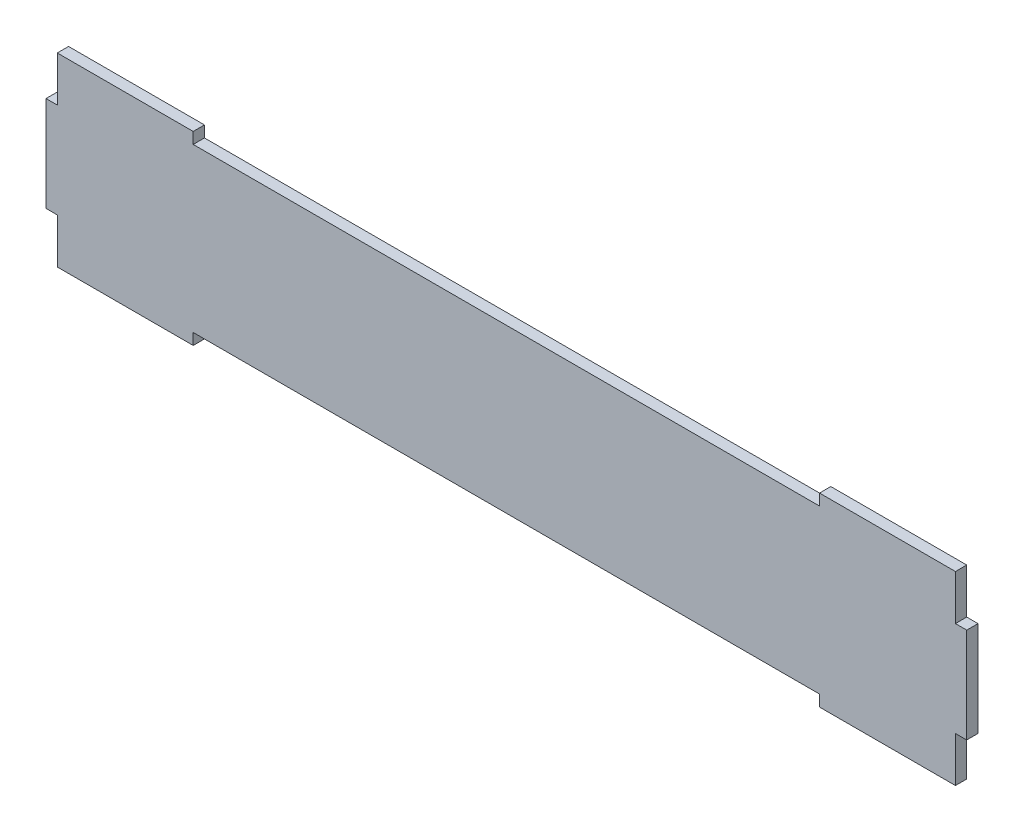
ISO-10303-21;
HEADER;
FILE_DESCRIPTION(('STEP AP214'),'2;1');
FILE_NAME('part.step','',(''),(''),'','','');
FILE_SCHEMA(('AUTOMOTIVE_DESIGN { 1 0 10303 214 1 1 1 1 }'));
ENDSEC;
DATA;
#1=APPLICATION_CONTEXT('core data for automotive mechanical design processes');
#2=APPLICATION_PROTOCOL_DEFINITION('international standard','automotive_design',2000,#1);
#3=PRODUCT_CONTEXT('',#1,'mechanical');
#4=PRODUCT('Part','Part','',(#3));
#5=PRODUCT_RELATED_PRODUCT_CATEGORY('part','',(#4));
#6=PRODUCT_DEFINITION_FORMATION('','',#4);
#7=PRODUCT_DEFINITION_CONTEXT('part definition',#1,'design');
#8=PRODUCT_DEFINITION('design','',#6,#7);
#9=PRODUCT_DEFINITION_SHAPE('','',#8);
#10=(LENGTH_UNIT() NAMED_UNIT(*) SI_UNIT(.MILLI.,.METRE.));
#11=(NAMED_UNIT(*) PLANE_ANGLE_UNIT() SI_UNIT($,.RADIAN.));
#12=(NAMED_UNIT(*) SI_UNIT($,.STERADIAN.) SOLID_ANGLE_UNIT());
#13=UNCERTAINTY_MEASURE_WITH_UNIT(LENGTH_MEASURE(1.E-05),#10,'distance_accuracy_value','');
#14=(GEOMETRIC_REPRESENTATION_CONTEXT(3) GLOBAL_UNCERTAINTY_ASSIGNED_CONTEXT((#13)) GLOBAL_UNIT_ASSIGNED_CONTEXT((#10,
#11,#12)) REPRESENTATION_CONTEXT('',''));
#15=CARTESIAN_POINT('',(0.,0.,0.));
#16=DIRECTION('',(0.,0.,1.));
#17=DIRECTION('',(1.,0.,0.));
#18=AXIS2_PLACEMENT_3D('',#15,#16,#17);
#19=CARTESIAN_POINT('',(0.,0.,6.));
#20=DIRECTION('',(0.,1.,0.));
#21=DIRECTION('',(0.,0.,1.));
#22=AXIS2_PLACEMENT_3D('',#19,#20,#21);
#23=PLANE('',#22);
#24=DIRECTION('',(1.,0.,0.));
#25=VECTOR('',#24,1.);
#26=CARTESIAN_POINT('',(0.,0.,0.));
#27=LINE('',#26,#25);
#28=CARTESIAN_POINT('',(6.,0.,0.));
#29=VERTEX_POINT('',#28);
#30=CARTESIAN_POINT('',(78.3333333333333,0.,0.));
#31=VERTEX_POINT('',#30);
#32=EDGE_CURVE('E201',#29,#31,#27,.T.);
#33=ORIENTED_EDGE('',*,*,#32,.T.);
#34=DIRECTION('',(0.,0.,1.));
#35=VECTOR('',#34,1.);
#36=CARTESIAN_POINT('',(78.3333333333333,0.,0.));
#37=LINE('',#36,#35);
#38=CARTESIAN_POINT('',(78.3333333333333,0.,6.));
#39=VERTEX_POINT('',#38);
#40=EDGE_CURVE('E220',#31,#39,#37,.T.);
#41=ORIENTED_EDGE('',*,*,#40,.T.);
#42=DIRECTION('',(1.,0.,0.));
#43=VECTOR('',#42,1.);
#44=CARTESIAN_POINT('',(0.,0.,6.));
#45=LINE('',#44,#43);
#46=CARTESIAN_POINT('',(6.,0.,6.));
#47=VERTEX_POINT('',#46);
#48=EDGE_CURVE('E301',#47,#39,#45,.T.);
#49=ORIENTED_EDGE('',*,*,#48,.F.);
#50=DIRECTION('',(0.,0.,1.));
#51=VECTOR('',#50,1.);
#52=CARTESIAN_POINT('',(6.,0.,0.));
#53=LINE('',#52,#51);
#54=EDGE_CURVE('E222',#29,#47,#53,.T.);
#55=ORIENTED_EDGE('',*,*,#54,.F.);
#56=EDGE_LOOP('',(#33,#41,#49,#55));
#57=FACE_BOUND('',#56,.T.);
#58=ADVANCED_FACE('F32',(#57),#23,.F.);
#59=CARTESIAN_POINT('',(0.,98.65,6.));
#60=DIRECTION('',(0.,-1.,0.));
#61=DIRECTION('',(0.,0.,-1.));
#62=AXIS2_PLACEMENT_3D('',#59,#60,#61);
#63=PLANE('',#62);
#64=DIRECTION('',(-1.,0.,0.));
#65=VECTOR('',#64,1.);
#66=CARTESIAN_POINT('',(0.,98.65,6.));
#67=LINE('',#66,#65);
#68=CARTESIAN_POINT('',(78.3333333333334,98.65,6.));
#69=VERTEX_POINT('',#68);
#70=CARTESIAN_POINT('',(6.,98.65,6.));
#71=VERTEX_POINT('',#70);
#72=EDGE_CURVE('E41',#69,#71,#67,.T.);
#73=ORIENTED_EDGE('',*,*,#72,.F.);
#74=DIRECTION('',(0.,0.,1.));
#75=VECTOR('',#74,1.);
#76=CARTESIAN_POINT('',(78.3333333333334,98.65,0.));
#77=LINE('',#76,#75);
#78=CARTESIAN_POINT('',(78.3333333333334,98.65,0.));
#79=VERTEX_POINT('',#78);
#80=EDGE_CURVE('E320',#79,#69,#77,.T.);
#81=ORIENTED_EDGE('',*,*,#80,.F.);
#82=DIRECTION('',(-1.,0.,0.));
#83=VECTOR('',#82,1.);
#84=CARTESIAN_POINT('',(0.,98.65,0.));
#85=LINE('',#84,#83);
#86=CARTESIAN_POINT('',(6.,98.65,0.));
#87=VERTEX_POINT('',#86);
#88=EDGE_CURVE('E208',#79,#87,#85,.T.);
#89=ORIENTED_EDGE('',*,*,#88,.T.);
#90=DIRECTION('',(0.,0.,1.));
#91=VECTOR('',#90,1.);
#92=CARTESIAN_POINT('',(6.,98.65,0.));
#93=LINE('',#92,#91);
#94=EDGE_CURVE('E278',#87,#71,#93,.T.);
#95=ORIENTED_EDGE('',*,*,#94,.T.);
#96=EDGE_LOOP('',(#73,#81,#89,#95));
#97=FACE_BOUND('',#96,.T.);
#98=ADVANCED_FACE('F366',(#97),#63,.F.);
#99=CARTESIAN_POINT('',(0.,0.,6.));
#100=DIRECTION('',(1.,0.,0.));
#101=DIRECTION('',(0.,0.,-1.));
#102=AXIS2_PLACEMENT_3D('',#99,#100,#101);
#103=PLANE('',#102);
#104=DIRECTION('',(0.,-1.,0.));
#105=VECTOR('',#104,1.);
#106=CARTESIAN_POINT('',(0.,0.,6.));
#107=LINE('',#106,#105);
#108=CARTESIAN_POINT('',(0.,74.65,6.));
#109=VERTEX_POINT('',#108);
#110=CARTESIAN_POINT('',(0.,24.,6.));
#111=VERTEX_POINT('',#110);
#112=EDGE_CURVE('E190',#109,#111,#107,.T.);
#113=ORIENTED_EDGE('',*,*,#112,.F.);
#114=DIRECTION('',(0.,0.,1.));
#115=VECTOR('',#114,1.);
#116=CARTESIAN_POINT('',(0.,74.65,0.));
#117=LINE('',#116,#115);
#118=CARTESIAN_POINT('',(0.,74.65,0.));
#119=VERTEX_POINT('',#118);
#120=EDGE_CURVE('E175',#119,#109,#117,.T.);
#121=ORIENTED_EDGE('',*,*,#120,.F.);
#122=DIRECTION('',(0.,-1.,0.));
#123=VECTOR('',#122,1.);
#124=CARTESIAN_POINT('',(0.,0.,0.));
#125=LINE('',#124,#123);
#126=CARTESIAN_POINT('',(0.,24.,0.));
#127=VERTEX_POINT('',#126);
#128=EDGE_CURVE('E188',#119,#127,#125,.T.);
#129=ORIENTED_EDGE('',*,*,#128,.T.);
#130=DIRECTION('',(0.,0.,1.));
#131=VECTOR('',#130,1.);
#132=CARTESIAN_POINT('',(0.,24.,0.));
#133=LINE('',#132,#131);
#134=EDGE_CURVE('E263',#127,#111,#133,.T.);
#135=ORIENTED_EDGE('',*,*,#134,.T.);
#136=EDGE_LOOP('',(#113,#121,#129,#135));
#137=FACE_BOUND('',#136,.T.);
#138=ADVANCED_FACE('F34',(#137),#103,.F.);
#139=CARTESIAN_POINT('',(411.666666666667,0.,6.));
#140=VERTEX_POINT('',#139);
#141=CARTESIAN_POINT('',(484.,0.,6.));
#142=VERTEX_POINT('',#141);
#143=EDGE_CURVE('E299',#140,#142,#45,.T.);
#144=ORIENTED_EDGE('',*,*,#143,.F.);
#145=DIRECTION('',(0.,0.,1.));
#146=VECTOR('',#145,1.);
#147=CARTESIAN_POINT('',(411.666666666667,0.,0.));
#148=LINE('',#147,#146);
#149=CARTESIAN_POINT('',(411.666666666667,0.,0.));
#150=VERTEX_POINT('',#149);
#151=EDGE_CURVE('E249',#150,#140,#148,.T.);
#152=ORIENTED_EDGE('',*,*,#151,.F.);
#153=CARTESIAN_POINT('',(484.,0.,0.));
#154=VERTEX_POINT('',#153);
#155=EDGE_CURVE('E197',#150,#154,#27,.T.);
#156=ORIENTED_EDGE('',*,*,#155,.T.);
#157=DIRECTION('',(0.,0.,1.));
#158=VECTOR('',#157,1.);
#159=CARTESIAN_POINT('',(484.,0.,0.));
#160=LINE('',#159,#158);
#161=EDGE_CURVE('E265',#154,#142,#160,.T.);
#162=ORIENTED_EDGE('',*,*,#161,.T.);
#163=EDGE_LOOP('',(#144,#152,#156,#162));
#164=FACE_BOUND('',#163,.T.);
#165=ADVANCED_FACE('F378',(#164),#23,.F.);
#166=CARTESIAN_POINT('',(490.,0.,6.));
#167=DIRECTION('',(-1.,0.,0.));
#168=DIRECTION('',(0.,0.,1.));
#169=AXIS2_PLACEMENT_3D('',#166,#167,#168);
#170=PLANE('',#169);
#171=DIRECTION('',(0.,1.,0.));
#172=VECTOR('',#171,1.);
#173=CARTESIAN_POINT('',(490.,0.,6.));
#174=LINE('',#173,#172);
#175=CARTESIAN_POINT('',(490.,24.,6.));
#176=VERTEX_POINT('',#175);
#177=CARTESIAN_POINT('',(490.,74.65,6.));
#178=VERTEX_POINT('',#177);
#179=EDGE_CURVE('E302',#176,#178,#174,.T.);
#180=ORIENTED_EDGE('',*,*,#179,.F.);
#181=DIRECTION('',(0.,0.,1.));
#182=VECTOR('',#181,1.);
#183=CARTESIAN_POINT('',(490.,24.,0.));
#184=LINE('',#183,#182);
#185=CARTESIAN_POINT('',(490.,24.,0.));
#186=VERTEX_POINT('',#185);
#187=EDGE_CURVE('E259',#186,#176,#184,.T.);
#188=ORIENTED_EDGE('',*,*,#187,.F.);
#189=DIRECTION('',(0.,1.,0.));
#190=VECTOR('',#189,1.);
#191=CARTESIAN_POINT('',(490.,0.,0.));
#192=LINE('',#191,#190);
#193=CARTESIAN_POINT('',(490.,74.65,0.));
#194=VERTEX_POINT('',#193);
#195=EDGE_CURVE('E207',#186,#194,#192,.T.);
#196=ORIENTED_EDGE('',*,*,#195,.T.);
#197=DIRECTION('',(0.,0.,1.));
#198=VECTOR('',#197,1.);
#199=CARTESIAN_POINT('',(490.,74.65,0.));
#200=LINE('',#199,#198);
#201=EDGE_CURVE('E198',#194,#178,#200,.T.);
#202=ORIENTED_EDGE('',*,*,#201,.T.);
#203=EDGE_LOOP('',(#180,#188,#196,#202));
#204=FACE_BOUND('',#203,.T.);
#205=ADVANCED_FACE('F385',(#204),#170,.F.);
#206=CARTESIAN_POINT('',(484.,98.65,0.));
#207=VERTEX_POINT('',#206);
#208=CARTESIAN_POINT('',(411.666666666667,98.65,0.));
#209=VERTEX_POINT('',#208);
#210=EDGE_CURVE('E36',#207,#209,#85,.T.);
#211=ORIENTED_EDGE('',*,*,#210,.T.);
#212=DIRECTION('',(0.,0.,1.));
#213=VECTOR('',#212,1.);
#214=CARTESIAN_POINT('',(411.666666666667,98.65,0.));
#215=LINE('',#214,#213);
#216=CARTESIAN_POINT('',(411.666666666667,98.65,6.));
#217=VERTEX_POINT('',#216);
#218=EDGE_CURVE('E323',#209,#217,#215,.T.);
#219=ORIENTED_EDGE('',*,*,#218,.T.);
#220=CARTESIAN_POINT('',(484.,98.65,6.));
#221=VERTEX_POINT('',#220);
#222=EDGE_CURVE('E11',#221,#217,#67,.T.);
#223=ORIENTED_EDGE('',*,*,#222,.F.);
#224=DIRECTION('',(0.,0.,1.));
#225=VECTOR('',#224,1.);
#226=CARTESIAN_POINT('',(484.,98.65,0.));
#227=LINE('',#226,#225);
#228=EDGE_CURVE('E291',#207,#221,#227,.T.);
#229=ORIENTED_EDGE('',*,*,#228,.F.);
#230=EDGE_LOOP('',(#211,#219,#223,#229));
#231=FACE_BOUND('',#230,.T.);
#232=ADVANCED_FACE('F361',(#231),#63,.F.);
#233=CARTESIAN_POINT('',(0.,0.,6.));
#234=DIRECTION('',(0.,0.,-1.));
#235=DIRECTION('',(-1.,0.,0.));
#236=AXIS2_PLACEMENT_3D('',#233,#234,#235);
#237=PLANE('',#236);
#238=ORIENTED_EDGE('',*,*,#48,.T.);
#239=DIRECTION('',(0.,-1.,0.));
#240=VECTOR('',#239,1.);
#241=CARTESIAN_POINT('',(78.3333333333333,0.,6.));
#242=LINE('',#241,#240);
#243=CARTESIAN_POINT('',(78.3333333333333,6.,6.));
#244=VERTEX_POINT('',#243);
#245=EDGE_CURVE('E240',#244,#39,#242,.T.);
#246=ORIENTED_EDGE('',*,*,#245,.F.);
#247=DIRECTION('',(-1.,0.,0.));
#248=VECTOR('',#247,1.);
#249=CARTESIAN_POINT('',(78.3333333333333,6.,6.));
#250=LINE('',#249,#248);
#251=CARTESIAN_POINT('',(411.666666666667,6.00000000000006,6.));
#252=VERTEX_POINT('',#251);
#253=EDGE_CURVE('E229',#252,#244,#250,.T.);
#254=ORIENTED_EDGE('',*,*,#253,.F.);
#255=DIRECTION('',(0.,1.,0.));
#256=VECTOR('',#255,1.);
#257=CARTESIAN_POINT('',(411.666666666667,0.,6.));
#258=LINE('',#257,#256);
#259=EDGE_CURVE('E233',#140,#252,#258,.T.);
#260=ORIENTED_EDGE('',*,*,#259,.F.);
#261=ORIENTED_EDGE('',*,*,#143,.T.);
#262=DIRECTION('',(0.,-1.,0.));
#263=VECTOR('',#262,1.);
#264=CARTESIAN_POINT('',(484.,0.,6.));
#265=LINE('',#264,#263);
#266=CARTESIAN_POINT('',(484.,24.,6.));
#267=VERTEX_POINT('',#266);
#268=EDGE_CURVE('E256',#267,#142,#265,.T.);
#269=ORIENTED_EDGE('',*,*,#268,.F.);
#270=DIRECTION('',(-1.,0.,0.));
#271=VECTOR('',#270,1.);
#272=CARTESIAN_POINT('',(490.,24.,6.));
#273=LINE('',#272,#271);
#274=EDGE_CURVE('E260',#176,#267,#273,.T.);
#275=ORIENTED_EDGE('',*,*,#274,.F.);
#276=ORIENTED_EDGE('',*,*,#179,.T.);
#277=DIRECTION('',(1.,0.,0.));
#278=VECTOR('',#277,1.);
#279=CARTESIAN_POINT('',(490.,74.65,6.));
#280=LINE('',#279,#278);
#281=CARTESIAN_POINT('',(484.,74.65,6.));
#282=VERTEX_POINT('',#281);
#283=EDGE_CURVE('E288',#282,#178,#280,.T.);
#284=ORIENTED_EDGE('',*,*,#283,.F.);
#285=DIRECTION('',(0.,-1.,0.));
#286=VECTOR('',#285,1.);
#287=CARTESIAN_POINT('',(484.,98.65,6.));
#288=LINE('',#287,#286);
#289=EDGE_CURVE('E268',#221,#282,#288,.T.);
#290=ORIENTED_EDGE('',*,*,#289,.F.);
#291=ORIENTED_EDGE('',*,*,#222,.T.);
#292=DIRECTION('',(0.,1.,0.));
#293=VECTOR('',#292,1.);
#294=CARTESIAN_POINT('',(411.666666666667,98.65,6.));
#295=LINE('',#294,#293);
#296=CARTESIAN_POINT('',(411.666666666667,92.65,6.));
#297=VERTEX_POINT('',#296);
#298=EDGE_CURVE('E334',#297,#217,#295,.T.);
#299=ORIENTED_EDGE('',*,*,#298,.F.);
#300=DIRECTION('',(1.,0.,0.));
#301=VECTOR('',#300,1.);
#302=CARTESIAN_POINT('',(78.3333333333333,92.65,6.));
#303=LINE('',#302,#301);
#304=CARTESIAN_POINT('',(78.3333333333333,92.65,6.));
#305=VERTEX_POINT('',#304);
#306=EDGE_CURVE('E340',#305,#297,#303,.T.);
#307=ORIENTED_EDGE('',*,*,#306,.F.);
#308=DIRECTION('',(0.,-1.,0.));
#309=VECTOR('',#308,1.);
#310=CARTESIAN_POINT('',(78.3333333333334,98.65,6.));
#311=LINE('',#310,#309);
#312=EDGE_CURVE('E246',#69,#305,#311,.T.);
#313=ORIENTED_EDGE('',*,*,#312,.F.);
#314=ORIENTED_EDGE('',*,*,#72,.T.);
#315=DIRECTION('',(0.,1.,0.));
#316=VECTOR('',#315,1.);
#317=CARTESIAN_POINT('',(6.,98.65,6.));
#318=LINE('',#317,#316);
#319=CARTESIAN_POINT('',(6.,74.65,6.));
#320=VERTEX_POINT('',#319);
#321=EDGE_CURVE('E182',#320,#71,#318,.T.);
#322=ORIENTED_EDGE('',*,*,#321,.F.);
#323=DIRECTION('',(1.,0.,0.));
#324=VECTOR('',#323,1.);
#325=CARTESIAN_POINT('',(0.,74.65,6.));
#326=LINE('',#325,#324);
#327=EDGE_CURVE('E319',#109,#320,#326,.T.);
#328=ORIENTED_EDGE('',*,*,#327,.F.);
#329=ORIENTED_EDGE('',*,*,#112,.T.);
#330=DIRECTION('',(-1.,0.,0.));
#331=VECTOR('',#330,1.);
#332=CARTESIAN_POINT('',(0.,24.,6.));
#333=LINE('',#332,#331);
#334=CARTESIAN_POINT('',(6.,24.,6.));
#335=VERTEX_POINT('',#334);
#336=EDGE_CURVE('E273',#335,#111,#333,.T.);
#337=ORIENTED_EDGE('',*,*,#336,.F.);
#338=DIRECTION('',(0.,1.,0.));
#339=VECTOR('',#338,1.);
#340=CARTESIAN_POINT('',(6.,0.,6.));
#341=LINE('',#340,#339);
#342=EDGE_CURVE('E275',#47,#335,#341,.T.);
#343=ORIENTED_EDGE('',*,*,#342,.F.);
#344=EDGE_LOOP('',(#238,#246,#254,#260,#261,#269,#275,#276,#284,#290,#291,#299,#307,#313,#314,
#322,#328,#329,#337,#343));
#345=FACE_BOUND('',#344,.T.);
#346=ADVANCED_FACE('F310',(#345),#237,.F.);
#347=CARTESIAN_POINT('',(0.,0.,0.));
#348=DIRECTION('',(0.,0.,-1.));
#349=DIRECTION('',(-1.,0.,0.));
#350=AXIS2_PLACEMENT_3D('',#347,#348,#349);
#351=PLANE('',#350);
#352=DIRECTION('',(0.,-1.,0.));
#353=VECTOR('',#352,1.);
#354=CARTESIAN_POINT('',(78.3333333333333,0.,0.));
#355=LINE('',#354,#353);
#356=CARTESIAN_POINT('',(78.3333333333333,6.,0.));
#357=VERTEX_POINT('',#356);
#358=EDGE_CURVE('E225',#357,#31,#355,.T.);
#359=ORIENTED_EDGE('',*,*,#358,.T.);
#360=ORIENTED_EDGE('',*,*,#32,.F.);
#361=DIRECTION('',(0.,1.,0.));
#362=VECTOR('',#361,1.);
#363=CARTESIAN_POINT('',(6.,0.,0.));
#364=LINE('',#363,#362);
#365=CARTESIAN_POINT('',(6.,24.,0.));
#366=VERTEX_POINT('',#365);
#367=EDGE_CURVE('E223',#29,#366,#364,.T.);
#368=ORIENTED_EDGE('',*,*,#367,.T.);
#369=DIRECTION('',(-1.,0.,0.));
#370=VECTOR('',#369,1.);
#371=CARTESIAN_POINT('',(0.,24.,0.));
#372=LINE('',#371,#370);
#373=EDGE_CURVE('E196',#366,#127,#372,.T.);
#374=ORIENTED_EDGE('',*,*,#373,.T.);
#375=ORIENTED_EDGE('',*,*,#128,.F.);
#376=DIRECTION('',(1.,0.,0.));
#377=VECTOR('',#376,1.);
#378=CARTESIAN_POINT('',(0.,74.65,0.));
#379=LINE('',#378,#377);
#380=CARTESIAN_POINT('',(6.,74.65,0.));
#381=VERTEX_POINT('',#380);
#382=EDGE_CURVE('E171',#119,#381,#379,.T.);
#383=ORIENTED_EDGE('',*,*,#382,.T.);
#384=DIRECTION('',(0.,1.,0.));
#385=VECTOR('',#384,1.);
#386=CARTESIAN_POINT('',(6.,98.65,0.));
#387=LINE('',#386,#385);
#388=EDGE_CURVE('E181',#381,#87,#387,.T.);
#389=ORIENTED_EDGE('',*,*,#388,.T.);
#390=ORIENTED_EDGE('',*,*,#88,.F.);
#391=DIRECTION('',(0.,-1.,0.));
#392=VECTOR('',#391,1.);
#393=CARTESIAN_POINT('',(78.3333333333334,98.65,0.));
#394=LINE('',#393,#392);
#395=CARTESIAN_POINT('',(78.3333333333333,92.65,0.));
#396=VERTEX_POINT('',#395);
#397=EDGE_CURVE('E330',#79,#396,#394,.T.);
#398=ORIENTED_EDGE('',*,*,#397,.T.);
#399=DIRECTION('',(1.,0.,0.));
#400=VECTOR('',#399,1.);
#401=CARTESIAN_POINT('',(78.3333333333333,92.65,0.));
#402=LINE('',#401,#400);
#403=CARTESIAN_POINT('',(411.666666666667,92.65,0.));
#404=VERTEX_POINT('',#403);
#405=EDGE_CURVE('E333',#396,#404,#402,.T.);
#406=ORIENTED_EDGE('',*,*,#405,.T.);
#407=DIRECTION('',(0.,1.,0.));
#408=VECTOR('',#407,1.);
#409=CARTESIAN_POINT('',(411.666666666667,98.65,0.));
#410=LINE('',#409,#408);
#411=EDGE_CURVE('E57',#404,#209,#410,.T.);
#412=ORIENTED_EDGE('',*,*,#411,.T.);
#413=ORIENTED_EDGE('',*,*,#210,.F.);
#414=DIRECTION('',(0.,-1.,0.));
#415=VECTOR('',#414,1.);
#416=CARTESIAN_POINT('',(484.,98.65,0.));
#417=LINE('',#416,#415);
#418=CARTESIAN_POINT('',(484.,74.65,0.));
#419=VERTEX_POINT('',#418);
#420=EDGE_CURVE('E284',#207,#419,#417,.T.);
#421=ORIENTED_EDGE('',*,*,#420,.T.);
#422=DIRECTION('',(1.,0.,0.));
#423=VECTOR('',#422,1.);
#424=CARTESIAN_POINT('',(490.,74.65,0.));
#425=LINE('',#424,#423);
#426=EDGE_CURVE('E287',#419,#194,#425,.T.);
#427=ORIENTED_EDGE('',*,*,#426,.T.);
#428=ORIENTED_EDGE('',*,*,#195,.F.);
#429=DIRECTION('',(-1.,0.,0.));
#430=VECTOR('',#429,1.);
#431=CARTESIAN_POINT('',(490.,24.,0.));
#432=LINE('',#431,#430);
#433=CARTESIAN_POINT('',(484.,24.,0.));
#434=VERTEX_POINT('',#433);
#435=EDGE_CURVE('E252',#186,#434,#432,.T.);
#436=ORIENTED_EDGE('',*,*,#435,.T.);
#437=DIRECTION('',(0.,-1.,0.));
#438=VECTOR('',#437,1.);
#439=CARTESIAN_POINT('',(484.,0.,0.));
#440=LINE('',#439,#438);
#441=EDGE_CURVE('E255',#434,#154,#440,.T.);
#442=ORIENTED_EDGE('',*,*,#441,.T.);
#443=ORIENTED_EDGE('',*,*,#155,.F.);
#444=DIRECTION('',(0.,1.,0.));
#445=VECTOR('',#444,1.);
#446=CARTESIAN_POINT('',(411.666666666667,0.,0.));
#447=LINE('',#446,#445);
#448=CARTESIAN_POINT('',(411.666666666667,6.00000000000006,0.));
#449=VERTEX_POINT('',#448);
#450=EDGE_CURVE('E228',#150,#449,#447,.T.);
#451=ORIENTED_EDGE('',*,*,#450,.T.);
#452=DIRECTION('',(-1.,0.,0.));
#453=VECTOR('',#452,1.);
#454=CARTESIAN_POINT('',(78.3333333333333,6.,0.));
#455=LINE('',#454,#453);
#456=EDGE_CURVE('E49',#449,#357,#455,.T.);
#457=ORIENTED_EDGE('',*,*,#456,.T.);
#458=EDGE_LOOP('',(#359,#360,#368,#374,#375,#383,#389,#390,#398,#406,#412,#413,#421,#427,#428,
#436,#442,#443,#451,#457));
#459=FACE_BOUND('',#458,.T.);
#460=ADVANCED_FACE('F194',(#459),#351,.T.);
#461=CARTESIAN_POINT('',(490.,74.65,0.));
#462=DIRECTION('',(0.,-1.,0.));
#463=DIRECTION('',(0.,0.,-1.));
#464=AXIS2_PLACEMENT_3D('',#461,#462,#463);
#465=PLANE('',#464);
#466=ORIENTED_EDGE('',*,*,#283,.T.);
#467=ORIENTED_EDGE('',*,*,#201,.F.);
#468=ORIENTED_EDGE('',*,*,#426,.F.);
#469=DIRECTION('',(0.,0.,1.));
#470=VECTOR('',#469,1.);
#471=CARTESIAN_POINT('',(484.,74.65,0.));
#472=LINE('',#471,#470);
#473=EDGE_CURVE('E204',#419,#282,#472,.T.);
#474=ORIENTED_EDGE('',*,*,#473,.T.);
#475=EDGE_LOOP('',(#466,#467,#468,#474));
#476=FACE_BOUND('',#475,.T.);
#477=ADVANCED_FACE('F404',(#476),#465,.F.);
#478=CARTESIAN_POINT('',(484.,98.65,0.));
#479=DIRECTION('',(-1.,0.,0.));
#480=DIRECTION('',(0.,0.,1.));
#481=AXIS2_PLACEMENT_3D('',#478,#479,#480);
#482=PLANE('',#481);
#483=ORIENTED_EDGE('',*,*,#289,.T.);
#484=ORIENTED_EDGE('',*,*,#473,.F.);
#485=ORIENTED_EDGE('',*,*,#420,.F.);
#486=ORIENTED_EDGE('',*,*,#228,.T.);
#487=EDGE_LOOP('',(#483,#484,#485,#486));
#488=FACE_BOUND('',#487,.T.);
#489=ADVANCED_FACE('F407',(#488),#482,.F.);
#490=CARTESIAN_POINT('',(484.,0.,0.));
#491=DIRECTION('',(-1.,0.,0.));
#492=DIRECTION('',(0.,0.,1.));
#493=AXIS2_PLACEMENT_3D('',#490,#491,#492);
#494=PLANE('',#493);
#495=ORIENTED_EDGE('',*,*,#268,.T.);
#496=ORIENTED_EDGE('',*,*,#161,.F.);
#497=ORIENTED_EDGE('',*,*,#441,.F.);
#498=DIRECTION('',(0.,0.,1.));
#499=VECTOR('',#498,1.);
#500=CARTESIAN_POINT('',(484.,24.,0.));
#501=LINE('',#500,#499);
#502=EDGE_CURVE('E269',#434,#267,#501,.T.);
#503=ORIENTED_EDGE('',*,*,#502,.T.);
#504=EDGE_LOOP('',(#495,#496,#497,#503));
#505=FACE_BOUND('',#504,.T.);
#506=ADVANCED_FACE('F400',(#505),#494,.F.);
#507=CARTESIAN_POINT('',(490.,24.,0.));
#508=DIRECTION('',(0.,1.,0.));
#509=DIRECTION('',(0.,0.,1.));
#510=AXIS2_PLACEMENT_3D('',#507,#508,#509);
#511=PLANE('',#510);
#512=ORIENTED_EDGE('',*,*,#274,.T.);
#513=ORIENTED_EDGE('',*,*,#502,.F.);
#514=ORIENTED_EDGE('',*,*,#435,.F.);
#515=ORIENTED_EDGE('',*,*,#187,.T.);
#516=EDGE_LOOP('',(#512,#513,#514,#515));
#517=FACE_BOUND('',#516,.T.);
#518=ADVANCED_FACE('F402',(#517),#511,.F.);
#519=CARTESIAN_POINT('',(0.,24.,0.));
#520=DIRECTION('',(0.,1.,0.));
#521=DIRECTION('',(0.,0.,1.));
#522=AXIS2_PLACEMENT_3D('',#519,#520,#521);
#523=PLANE('',#522);
#524=ORIENTED_EDGE('',*,*,#336,.T.);
#525=ORIENTED_EDGE('',*,*,#134,.F.);
#526=ORIENTED_EDGE('',*,*,#373,.F.);
#527=DIRECTION('',(0.,0.,1.));
#528=VECTOR('',#527,1.);
#529=CARTESIAN_POINT('',(6.,24.,0.));
#530=LINE('',#529,#528);
#531=EDGE_CURVE('E281',#366,#335,#530,.T.);
#532=ORIENTED_EDGE('',*,*,#531,.T.);
#533=EDGE_LOOP('',(#524,#525,#526,#532));
#534=FACE_BOUND('',#533,.T.);
#535=ADVANCED_FACE('F317',(#534),#523,.F.);
#536=CARTESIAN_POINT('',(6.,0.,0.));
#537=DIRECTION('',(1.,0.,0.));
#538=DIRECTION('',(0.,1.,0.));
#539=AXIS2_PLACEMENT_3D('',#536,#537,#538);
#540=PLANE('',#539);
#541=ORIENTED_EDGE('',*,*,#342,.T.);
#542=ORIENTED_EDGE('',*,*,#531,.F.);
#543=ORIENTED_EDGE('',*,*,#367,.F.);
#544=ORIENTED_EDGE('',*,*,#54,.T.);
#545=EDGE_LOOP('',(#541,#542,#543,#544));
#546=FACE_BOUND('',#545,.T.);
#547=ADVANCED_FACE('F315',(#546),#540,.F.);
#548=CARTESIAN_POINT('',(6.,98.65,0.));
#549=DIRECTION('',(1.,0.,0.));
#550=DIRECTION('',(0.,1.,0.));
#551=AXIS2_PLACEMENT_3D('',#548,#549,#550);
#552=PLANE('',#551);
#553=ORIENTED_EDGE('',*,*,#321,.T.);
#554=ORIENTED_EDGE('',*,*,#94,.F.);
#555=ORIENTED_EDGE('',*,*,#388,.F.);
#556=DIRECTION('',(0.,0.,1.));
#557=VECTOR('',#556,1.);
#558=CARTESIAN_POINT('',(6.,74.65,0.));
#559=LINE('',#558,#557);
#560=EDGE_CURVE('E177',#381,#320,#559,.T.);
#561=ORIENTED_EDGE('',*,*,#560,.T.);
#562=EDGE_LOOP('',(#553,#554,#555,#561));
#563=FACE_BOUND('',#562,.T.);
#564=ADVANCED_FACE('F368',(#563),#552,.F.);
#565=CARTESIAN_POINT('',(0.,74.65,0.));
#566=DIRECTION('',(0.,-1.,0.));
#567=DIRECTION('',(0.,0.,-1.));
#568=AXIS2_PLACEMENT_3D('',#565,#566,#567);
#569=PLANE('',#568);
#570=ORIENTED_EDGE('',*,*,#327,.T.);
#571=ORIENTED_EDGE('',*,*,#560,.F.);
#572=ORIENTED_EDGE('',*,*,#382,.F.);
#573=ORIENTED_EDGE('',*,*,#120,.T.);
#574=EDGE_LOOP('',(#570,#571,#572,#573));
#575=FACE_BOUND('',#574,.T.);
#576=ADVANCED_FACE('F174',(#575),#569,.F.);
#577=CARTESIAN_POINT('',(78.3333333333334,98.65,0.));
#578=DIRECTION('',(-1.,0.,0.));
#579=DIRECTION('',(0.,-1.,0.));
#580=AXIS2_PLACEMENT_3D('',#577,#578,#579);
#581=PLANE('',#580);
#582=ORIENTED_EDGE('',*,*,#312,.T.);
#583=DIRECTION('',(0.,0.,1.));
#584=VECTOR('',#583,1.);
#585=CARTESIAN_POINT('',(78.3333333333333,92.65,0.));
#586=LINE('',#585,#584);
#587=EDGE_CURVE('E236',#396,#305,#586,.T.);
#588=ORIENTED_EDGE('',*,*,#587,.F.);
#589=ORIENTED_EDGE('',*,*,#397,.F.);
#590=ORIENTED_EDGE('',*,*,#80,.T.);
#591=EDGE_LOOP('',(#582,#588,#589,#590));
#592=FACE_BOUND('',#591,.T.);
#593=ADVANCED_FACE('F353',(#592),#581,.F.);
#594=CARTESIAN_POINT('',(411.666666666667,98.65,0.));
#595=DIRECTION('',(1.,0.,0.));
#596=DIRECTION('',(0.,0.,-1.));
#597=AXIS2_PLACEMENT_3D('',#594,#595,#596);
#598=PLANE('',#597);
#599=ORIENTED_EDGE('',*,*,#298,.T.);
#600=ORIENTED_EDGE('',*,*,#218,.F.);
#601=ORIENTED_EDGE('',*,*,#411,.F.);
#602=DIRECTION('',(0.,0.,1.));
#603=VECTOR('',#602,1.);
#604=CARTESIAN_POINT('',(411.666666666667,92.65,0.));
#605=LINE('',#604,#603);
#606=EDGE_CURVE('E345',#404,#297,#605,.T.);
#607=ORIENTED_EDGE('',*,*,#606,.T.);
#608=EDGE_LOOP('',(#599,#600,#601,#607));
#609=FACE_BOUND('',#608,.T.);
#610=ADVANCED_FACE('F358',(#609),#598,.F.);
#611=CARTESIAN_POINT('',(78.3333333333333,92.65,0.));
#612=DIRECTION('',(0.,-1.,0.));
#613=DIRECTION('',(1.,0.,0.));
#614=AXIS2_PLACEMENT_3D('',#611,#612,#613);
#615=PLANE('',#614);
#616=ORIENTED_EDGE('',*,*,#306,.T.);
#617=ORIENTED_EDGE('',*,*,#606,.F.);
#618=ORIENTED_EDGE('',*,*,#405,.F.);
#619=ORIENTED_EDGE('',*,*,#587,.T.);
#620=EDGE_LOOP('',(#616,#617,#618,#619));
#621=FACE_BOUND('',#620,.T.);
#622=ADVANCED_FACE('F348',(#621),#615,.F.);
#623=CARTESIAN_POINT('',(78.3333333333333,0.,0.));
#624=DIRECTION('',(-1.,0.,0.));
#625=DIRECTION('',(0.,0.,1.));
#626=AXIS2_PLACEMENT_3D('',#623,#624,#625);
#627=PLANE('',#626);
#628=ORIENTED_EDGE('',*,*,#245,.T.);
#629=ORIENTED_EDGE('',*,*,#40,.F.);
#630=ORIENTED_EDGE('',*,*,#358,.F.);
#631=DIRECTION('',(0.,0.,1.));
#632=VECTOR('',#631,1.);
#633=CARTESIAN_POINT('',(78.3333333333333,6.,0.));
#634=LINE('',#633,#632);
#635=EDGE_CURVE('E244',#357,#244,#634,.T.);
#636=ORIENTED_EDGE('',*,*,#635,.T.);
#637=EDGE_LOOP('',(#628,#629,#630,#636));
#638=FACE_BOUND('',#637,.T.);
#639=ADVANCED_FACE('F505',(#638),#627,.F.);
#640=CARTESIAN_POINT('',(78.3333333333333,6.,0.));
#641=DIRECTION('',(0.,1.,0.));
#642=DIRECTION('',(-1.,0.,0.));
#643=AXIS2_PLACEMENT_3D('',#640,#641,#642);
#644=PLANE('',#643);
#645=ORIENTED_EDGE('',*,*,#253,.T.);
#646=ORIENTED_EDGE('',*,*,#635,.F.);
#647=ORIENTED_EDGE('',*,*,#456,.F.);
#648=DIRECTION('',(0.,0.,1.));
#649=VECTOR('',#648,1.);
#650=CARTESIAN_POINT('',(411.666666666667,6.00000000000006,0.));
#651=LINE('',#650,#649);
#652=EDGE_CURVE('E247',#449,#252,#651,.T.);
#653=ORIENTED_EDGE('',*,*,#652,.T.);
#654=EDGE_LOOP('',(#645,#646,#647,#653));
#655=FACE_BOUND('',#654,.T.);
#656=ADVANCED_FACE('F514',(#655),#644,.F.);
#657=CARTESIAN_POINT('',(411.666666666667,0.,0.));
#658=DIRECTION('',(1.,0.,0.));
#659=DIRECTION('',(0.,0.,-1.));
#660=AXIS2_PLACEMENT_3D('',#657,#658,#659);
#661=PLANE('',#660);
#662=ORIENTED_EDGE('',*,*,#259,.T.);
#663=ORIENTED_EDGE('',*,*,#652,.F.);
#664=ORIENTED_EDGE('',*,*,#450,.F.);
#665=ORIENTED_EDGE('',*,*,#151,.T.);
#666=EDGE_LOOP('',(#662,#663,#664,#665));
#667=FACE_BOUND('',#666,.T.);
#668=ADVANCED_FACE('F397',(#667),#661,.F.);
#669=CLOSED_SHELL('',(#58,#98,#138,#165,#205,#232,#346,#460,#477,#489,#506,#518,#535,#547,#564,
#576,#593,#610,#622,#639,#656,#668));
#670=MANIFOLD_SOLID_BREP('B2',#669);
#671=ADVANCED_BREP_SHAPE_REPRESENTATION('',(#18,#670),#14);
#672=SHAPE_DEFINITION_REPRESENTATION(#9,#671);
ENDSEC;
END-ISO-10303-21;
